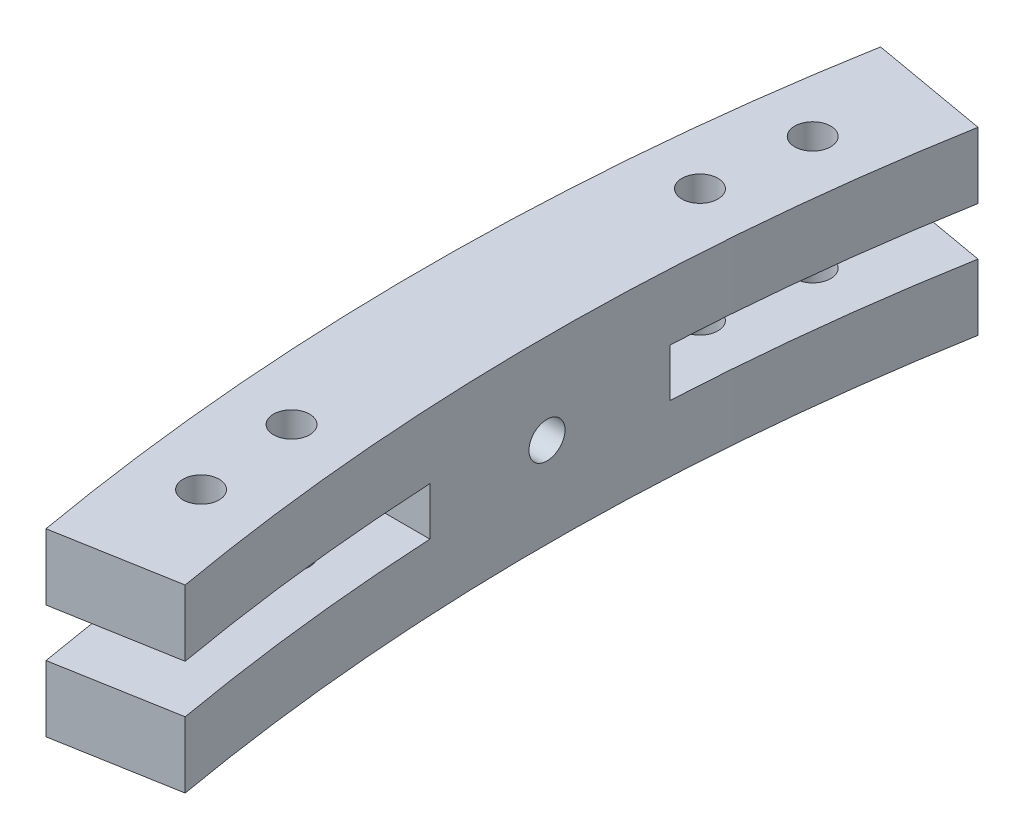
ISO-10303-21;
HEADER;
FILE_DESCRIPTION(('STEP AP214'),'2;1');
FILE_NAME('part.step','',(''),(''),'','','');
FILE_SCHEMA(('AUTOMOTIVE_DESIGN { 1 0 10303 214 1 1 1 1 }'));
ENDSEC;
DATA;
#1=APPLICATION_CONTEXT('core data for automotive mechanical design processes');
#2=APPLICATION_PROTOCOL_DEFINITION('international standard','automotive_design',2000,#1);
#3=PRODUCT_CONTEXT('',#1,'mechanical');
#4=PRODUCT('Part','Part','',(#3));
#5=PRODUCT_RELATED_PRODUCT_CATEGORY('part','',(#4));
#6=PRODUCT_DEFINITION_FORMATION('','',#4);
#7=PRODUCT_DEFINITION_CONTEXT('part definition',#1,'design');
#8=PRODUCT_DEFINITION('design','',#6,#7);
#9=PRODUCT_DEFINITION_SHAPE('','',#8);
#10=(LENGTH_UNIT() NAMED_UNIT(*) SI_UNIT(.MILLI.,.METRE.));
#11=(NAMED_UNIT(*) PLANE_ANGLE_UNIT() SI_UNIT($,.RADIAN.));
#12=(NAMED_UNIT(*) SI_UNIT($,.STERADIAN.) SOLID_ANGLE_UNIT());
#13=UNCERTAINTY_MEASURE_WITH_UNIT(LENGTH_MEASURE(1.E-05),#10,'distance_accuracy_value','');
#14=(GEOMETRIC_REPRESENTATION_CONTEXT(3) GLOBAL_UNCERTAINTY_ASSIGNED_CONTEXT((#13)) GLOBAL_UNIT_ASSIGNED_CONTEXT((#10,
#11,#12)) REPRESENTATION_CONTEXT('',''));
#15=CARTESIAN_POINT('',(0.,0.,0.));
#16=DIRECTION('',(0.,0.,1.));
#17=DIRECTION('',(1.,0.,0.));
#18=AXIS2_PLACEMENT_3D('',#15,#16,#17);
#19=CARTESIAN_POINT('',(0.,7.5,0.));
#20=DIRECTION('',(-0.173648177666931,0.,0.984807753012208));
#21=DIRECTION('',(0.984807753012208,0.,0.173648177666931));
#22=AXIS2_PLACEMENT_3D('',#19,#20,#21);
#23=PLANE('',#22);
#24=DIRECTION('',(0.984807753012207,0.,0.173648177666939));
#25=VECTOR('',#24,1.);
#26=CARTESIAN_POINT('',(-187.11347307232,-2.,-32.9931537567168));
#27=LINE('',#26,#25);
#28=CARTESIAN_POINT('',(-196.961550602442,-2.,-34.7296355333861));
#29=VERTEX_POINT('',#28);
#30=CARTESIAN_POINT('',(-187.11347307232,-2.,-32.9931537567168));
#31=VERTEX_POINT('',#30);
#32=EDGE_CURVE('E51',#29,#31,#27,.T.);
#33=ORIENTED_EDGE('',*,*,#32,.T.);
#34=DIRECTION('',(0.,-1.,0.));
#35=VECTOR('',#34,1.);
#36=CARTESIAN_POINT('',(-187.11347307232,7.5,-32.9931537567168));
#37=LINE('',#36,#35);
#38=CARTESIAN_POINT('',(-187.11347307232,-7.5,-32.9931537567168));
#39=VERTEX_POINT('',#38);
#40=EDGE_CURVE('E43',#31,#39,#37,.T.);
#41=ORIENTED_EDGE('',*,*,#40,.T.);
#42=DIRECTION('',(-0.984807753012208,0.,-0.173648177666931));
#43=VECTOR('',#42,1.);
#44=CARTESIAN_POINT('',(0.,-7.5,0.));
#45=LINE('',#44,#43);
#46=CARTESIAN_POINT('',(-196.961550602442,-7.49999999999999,-34.7296355333861));
#47=VERTEX_POINT('',#46);
#48=EDGE_CURVE('E203',#39,#47,#45,.T.);
#49=ORIENTED_EDGE('',*,*,#48,.T.);
#50=DIRECTION('',(0.,-1.,0.));
#51=VECTOR('',#50,1.);
#52=CARTESIAN_POINT('',(-196.961550602442,7.50000000000001,-34.7296355333861));
#53=LINE('',#52,#51);
#54=EDGE_CURVE('E216',#29,#47,#53,.T.);
#55=ORIENTED_EDGE('',*,*,#54,.F.);
#56=EDGE_LOOP('',(#33,#41,#49,#55));
#57=FACE_BOUND('',#56,.T.);
#58=ADVANCED_FACE('F33',(#57),#23,.F.);
#59=CARTESIAN_POINT('',(0.,7.5,0.));
#60=DIRECTION('',(0.17364817766693,0.,0.984807753012208));
#61=DIRECTION('',(0.984807753012208,0.,-0.17364817766693));
#62=AXIS2_PLACEMENT_3D('',#59,#60,#61);
#63=PLANE('',#62);
#64=DIRECTION('',(0.,-1.,0.));
#65=VECTOR('',#64,1.);
#66=CARTESIAN_POINT('',(-187.11347307232,7.5,32.9931537567168));
#67=LINE('',#66,#65);
#68=CARTESIAN_POINT('',(-187.11347307232,-2.,32.9931537567168));
#69=VERTEX_POINT('',#68);
#70=CARTESIAN_POINT('',(-187.11347307232,-7.5,32.9931537567168));
#71=VERTEX_POINT('',#70);
#72=EDGE_CURVE('E200',#69,#71,#67,.T.);
#73=ORIENTED_EDGE('',*,*,#72,.F.);
#74=DIRECTION('',(-0.984807753012207,0.,0.173648177666939));
#75=VECTOR('',#74,1.);
#76=CARTESIAN_POINT('',(-187.11347307232,-2.,32.9931537567168));
#77=LINE('',#76,#75);
#78=CARTESIAN_POINT('',(-196.961550602442,-2.,34.7296355333861));
#79=VERTEX_POINT('',#78);
#80=EDGE_CURVE('E146',#69,#79,#77,.T.);
#81=ORIENTED_EDGE('',*,*,#80,.T.);
#82=DIRECTION('',(0.,-1.,0.));
#83=VECTOR('',#82,1.);
#84=CARTESIAN_POINT('',(-196.961550602442,7.49999999999999,34.7296355333861));
#85=LINE('',#84,#83);
#86=CARTESIAN_POINT('',(-196.961550602442,-7.50000000000001,34.7296355333861));
#87=VERTEX_POINT('',#86);
#88=EDGE_CURVE('E145',#79,#87,#85,.T.);
#89=ORIENTED_EDGE('',*,*,#88,.T.);
#90=DIRECTION('',(-0.98480775301221,0.,0.173648177666931));
#91=VECTOR('',#90,1.);
#92=CARTESIAN_POINT('',(0.,-7.5,0.));
#93=LINE('',#92,#91);
#94=EDGE_CURVE('E193',#71,#87,#93,.T.);
#95=ORIENTED_EDGE('',*,*,#94,.F.);
#96=EDGE_LOOP('',(#73,#81,#89,#95));
#97=FACE_BOUND('',#96,.T.);
#98=ADVANCED_FACE('F303',(#97),#63,.T.);
#99=CARTESIAN_POINT('',(0.,7.5,0.));
#100=DIRECTION('',(0.,-1.,0.));
#101=DIRECTION('',(0.,0.,-1.));
#102=AXIS2_PLACEMENT_3D('',#99,#100,#101);
#103=CYLINDRICAL_SURFACE('',#102,190.);
#104=CARTESIAN_POINT('',(-189.994078855105,0.,1.5));
#105=CARTESIAN_POINT('',(-189.994078935175,-0.0842542498652497,1.49999626420756));
#106=CARTESIAN_POINT('',(-189.994135501681,-0.168569558574836,1.49287740125156));
#107=CARTESIAN_POINT('',(-189.994355718061,-0.334877991761664,1.464577685945));
#108=CARTESIAN_POINT('',(-189.994519496756,-0.41686819872606,1.44337991673716));
#109=CARTESIAN_POINT('',(-189.994935583111,-0.576092976261965,1.38752596472184));
#110=CARTESIAN_POINT('',(-189.995187848409,-0.653329801684315,1.35287622100358));
#111=CARTESIAN_POINT('',(-189.995752428164,-0.800868351435513,1.27111077045056));
#112=CARTESIAN_POINT('',(-189.996064727703,-0.871171792112026,1.22399815946503));
#113=CARTESIAN_POINT('',(-189.996714250838,-1.0028815252355,1.11863372876489));
#114=CARTESIAN_POINT('',(-189.997051477522,-1.06428671237465,1.06038052728897));
#115=CARTESIAN_POINT('',(-189.997712818179,-1.17644801969412,0.93438959994903));
#116=CARTESIAN_POINT('',(-189.998036931636,-1.22720372126568,0.866651501428184));
#117=CARTESIAN_POINT('',(-189.998635488171,-1.31662216222264,0.723615732245298));
#118=CARTESIAN_POINT('',(-189.998909931527,-1.35528496906106,0.648318103752686));
#119=CARTESIAN_POINT('',(-189.999378208169,-1.41942025816344,0.492300545057282));
#120=CARTESIAN_POINT('',(-189.999572041629,-1.44489276877503,0.411580626508104));
#121=CARTESIAN_POINT('',(-189.99985724286,-1.48192402376422,0.24701140420058));
#122=CARTESIAN_POINT('',(-189.9999486126,-1.49348303569622,0.163162160650631));
#123=CARTESIAN_POINT('',(-190.000018591789,-1.50235997363369,-0.00528669248303473));
#124=CARTESIAN_POINT('',(-189.999997201456,-1.49967792745955,-0.0898863006005673));
#125=CARTESIAN_POINT('',(-189.999844074324,-1.48014918474189,-0.257432546271555));
#126=CARTESIAN_POINT('',(-189.999712339944,-1.46330279884005,-0.340379220035087));
#127=CARTESIAN_POINT('',(-189.999353378988,-1.41592405232442,-0.502267051856959));
#128=CARTESIAN_POINT('',(-189.999126152304,-1.38539167617525,-0.581208205368402));
#129=CARTESIAN_POINT('',(-189.998601820089,-1.31150731724564,-0.732844997240332));
#130=CARTESIAN_POINT('',(-189.998304713789,-1.26815519328015,-0.805540566806263));
#131=CARTESIAN_POINT('',(-189.997674117993,-1.16986209963765,-0.942621805353064));
#132=CARTESIAN_POINT('',(-189.997340628504,-1.11492113249175,-1.00700747614889));
#133=CARTESIAN_POINT('',(-189.996674852802,-0.995008156989786,-1.12564307970718));
#134=CARTESIAN_POINT('',(-189.996342566623,-0.930035873617452,-1.17989273449281));
#135=CARTESIAN_POINT('',(-189.995716669408,-0.791905598254803,-1.27671418714655));
#136=CARTESIAN_POINT('',(-189.995423058377,-0.718747605179786,-1.31928598346721));
#137=CARTESIAN_POINT('',(-189.994907614909,-0.566322506994446,-1.3915431898295));
#138=CARTESIAN_POINT('',(-189.994685782515,-0.487055398227194,-1.42122859215723));
#139=CARTESIAN_POINT('',(-189.994338908491,-0.324662293857678,-1.46687015760124));
#140=CARTESIAN_POINT('',(-189.994213866839,-0.241536299144512,-1.48282632388076));
#141=CARTESIAN_POINT('',(-189.994074675207,-0.0737875239848442,-1.50055613342709));
#142=CARTESIAN_POINT('',(-189.994060522234,0.0108352159824113,-1.5023301596617));
#143=CARTESIAN_POINT('',(-189.994144695782,0.179177410319083,-1.4916463268602));
#144=CARTESIAN_POINT('',(-189.9942430223,0.262896864723019,-1.47918846836798));
#145=CARTESIAN_POINT('',(-189.99454106666,0.427054877523202,-1.44039482268101));
#146=CARTESIAN_POINT('',(-189.994740783239,0.507493476766346,-1.41405920832224));
#147=CARTESIAN_POINT('',(-189.995219090235,0.662807610718776,-1.34825781994065));
#148=CARTESIAN_POINT('',(-189.995497680654,0.737683145327146,-1.30879204567965));
#149=CARTESIAN_POINT('',(-189.996102333936,0.879747424625106,-1.21784966841184));
#150=CARTESIAN_POINT('',(-189.996428397815,0.94693600493424,-1.16637280862741));
#151=CARTESIAN_POINT('',(-189.997091233574,1.07171746829914,-1.05286988990802));
#152=CARTESIAN_POINT('',(-189.99742800546,1.12931034604635,-0.990843825137043));
#153=CARTESIAN_POINT('',(-189.998074297715,1.23326677275511,-0.858001586929432));
#154=CARTESIAN_POINT('',(-189.998383817477,1.27963007162096,-0.787185217775669));
#155=CARTESIAN_POINT('',(-189.998940700903,1.35980947576566,-0.638773714203637));
#156=CARTESIAN_POINT('',(-189.999188064638,1.39362559533438,-0.561178587505761));
#157=CARTESIAN_POINT('',(-189.999592745403,1.44775032449014,-0.401413165130037));
#158=CARTESIAN_POINT('',(-189.999750063537,1.46805909960937,-0.319242925533465));
#159=CARTESIAN_POINT('',(-189.999956921438,1.4945932030958,-0.152658900353831));
#160=CARTESIAN_POINT('',(-190.000006461031,1.50081850869532,-0.0682451111440142));
#161=CARTESIAN_POINT('',(-189.99999217624,1.49900887400175,0.100427000874377));
#162=CARTESIAN_POINT('',(-189.999928355149,1.49097434815825,0.18468532813007));
#163=CARTESIAN_POINT('',(-189.999694550289,1.46087393297556,0.350657295959764));
#164=CARTESIAN_POINT('',(-189.999524566305,1.43880801544424,0.432370931420577));
#165=CARTESIAN_POINT('',(-189.9990975949,1.38127078024911,0.590935272061317));
#166=CARTESIAN_POINT('',(-189.998840605864,1.34579921365864,0.66778588690991));
#167=CARTESIAN_POINT('',(-189.998268609015,1.26245914419382,0.814438232011643));
#168=CARTESIAN_POINT('',(-189.997953603469,1.21459112542168,0.884240237376863));
#169=CARTESIAN_POINT('',(-189.997301102054,1.10782113690975,1.01481249589707));
#170=CARTESIAN_POINT('',(-189.996963607928,1.0489200218718,1.07558344800793));
#171=CARTESIAN_POINT('',(-189.996304066323,0.921734120657375,1.18638963989384));
#172=CARTESIAN_POINT('',(-189.995982022702,0.853447006426181,1.2364222082646));
#173=CARTESIAN_POINT('',(-189.995389637901,0.709414633223466,1.32433227043303));
#174=CARTESIAN_POINT('',(-189.995119322094,0.633665741667304,1.36220380533006));
#175=CARTESIAN_POINT('',(-189.994661401408,0.476944130327464,1.42464849448115));
#176=CARTESIAN_POINT('',(-189.99447369746,0.395977801717122,1.44923758524254));
#177=CARTESIAN_POINT('',(-189.994252589345,0.262079819242925,1.47786842844121));
#178=CARTESIAN_POINT('',(-189.994187719833,0.210018141807059,1.48615740416407));
#179=CARTESIAN_POINT('',(-189.994100827688,0.105312262708029,1.49722435752657));
#180=CARTESIAN_POINT('',(-189.994078805053,0.0526680610564884,1.5000023352762));
#181=CARTESIAN_POINT('',(-189.994078855105,0.,1.5));
#182=B_SPLINE_CURVE_WITH_KNOTS('',3,(#104,#105,#106,#107,#108,#109,#110,#111,#112,#113,#114,
#115,#116,#117,#118,#119,#120,#121,#122,#123,#124,#125,#126,#127,#128,#129,#130,#131,#132,#133,
#134,#135,#136,#137,#138,#139,#140,#141,#142,#143,#144,#145,#146,#147,#148,#149,#150,#151,#152,
#153,#154,#155,#156,#157,#158,#159,#160,#161,#162,#163,#164,#165,#166,#167,#168,#169,#170,#171,
#172,#173,#174,#175,#176,#177,#178,#179,#180,#181),.UNSPECIFIED.,.T.,.F.,(4,2,2,2,2,2,2,2,2,2,2,
2,2,2,2,2,2,2,2,2,2,2,2,2,2,2,2,2,2,2,2,2,2,2,2,2,2,2,4),(0.,0.252570510832021,
0.505445054367304,0.758198702780257,1.01088962456841,1.26361190782247,1.51634412319515,
1.76907492882663,2.02180519130515,2.27453059374281,2.52725550247303,2.77997486877449,
3.03269452194583,3.28541695844508,3.53813933974753,3.79086865085986,4.04359799546178,
4.29632749134921,4.54905692900731,4.80177954205594,5.05450214544662,5.30722160146062,
5.55994106205903,5.81266592588696,6.06539092952766,6.31812156112909,6.57085190489689,
6.82357915140317,7.07630680647429,7.32902711635661,7.58174793401081,7.83447344461478,
8.08718908735243,8.33988516103543,8.59264402563312,8.84552655363075,9.09810499101899,
9.25598900722368,9.41387302027756),.UNSPECIFIED.);
#183=CARTESIAN_POINT('',(-189.994078855105,0.,1.5));
#184=VERTEX_POINT('',#183);
#185=EDGE_CURVE('E235',#184,#184,#182,.T.);
#186=ORIENTED_EDGE('',*,*,#185,.F.);
#187=EDGE_LOOP('',(#186));
#188=FACE_BOUND('',#187,.T.);
#189=CARTESIAN_POINT('',(0.,2.,0.));
#190=DIRECTION('',(0.,1.,0.));
#191=DIRECTION('',(0.,0.,1.));
#192=AXIS2_PLACEMENT_3D('',#189,#190,#191);
#193=CIRCLE('',#192,190.);
#194=CARTESIAN_POINT('',(-187.11347307232,2.,32.9931537567168));
#195=VERTEX_POINT('',#194);
#196=CARTESIAN_POINT('',(-189.736659610103,2.,10.));
#197=VERTEX_POINT('',#196);
#198=EDGE_CURVE('E162',#195,#197,#193,.F.);
#199=ORIENTED_EDGE('',*,*,#198,.T.);
#200=DIRECTION('',(0.,-1.,0.));
#201=VECTOR('',#200,1.);
#202=CARTESIAN_POINT('',(-189.736659610103,29.7710772670783,10.));
#203=LINE('',#202,#201);
#204=CARTESIAN_POINT('',(-189.736659610103,-2.,10.));
#205=VERTEX_POINT('',#204);
#206=EDGE_CURVE('E135',#197,#205,#203,.T.);
#207=ORIENTED_EDGE('',*,*,#206,.T.);
#208=CARTESIAN_POINT('',(0.,-2.,0.));
#209=DIRECTION('',(0.,1.,0.));
#210=DIRECTION('',(0.,0.,1.));
#211=AXIS2_PLACEMENT_3D('',#208,#209,#210);
#212=CIRCLE('',#211,190.);
#213=EDGE_CURVE('E139',#205,#69,#212,.T.);
#214=ORIENTED_EDGE('',*,*,#213,.T.);
#215=ORIENTED_EDGE('',*,*,#72,.T.);
#216=CARTESIAN_POINT('',(0.,-7.5,0.));
#217=DIRECTION('',(0.,1.,0.));
#218=DIRECTION('',(0.,0.,1.));
#219=AXIS2_PLACEMENT_3D('',#216,#217,#218);
#220=CIRCLE('',#219,190.);
#221=EDGE_CURVE('E160',#39,#71,#220,.T.);
#222=ORIENTED_EDGE('',*,*,#221,.F.);
#223=ORIENTED_EDGE('',*,*,#40,.F.);
#224=CARTESIAN_POINT('',(0.,-2.,0.));
#225=DIRECTION('',(0.,1.,0.));
#226=DIRECTION('',(0.,0.,1.));
#227=AXIS2_PLACEMENT_3D('',#224,#225,#226);
#228=CIRCLE('',#227,190.);
#229=CARTESIAN_POINT('',(-189.736659610103,-2.,-10.));
#230=VERTEX_POINT('',#229);
#231=EDGE_CURVE('E174',#31,#230,#228,.T.);
#232=ORIENTED_EDGE('',*,*,#231,.T.);
#233=DIRECTION('',(0.,-1.,0.));
#234=VECTOR('',#233,1.);
#235=CARTESIAN_POINT('',(-189.736659610103,29.7710772670783,-10.));
#236=LINE('',#235,#234);
#237=CARTESIAN_POINT('',(-189.736659610103,2.,-10.));
#238=VERTEX_POINT('',#237);
#239=EDGE_CURVE('E179',#238,#230,#236,.T.);
#240=ORIENTED_EDGE('',*,*,#239,.F.);
#241=CARTESIAN_POINT('',(0.,2.,0.));
#242=DIRECTION('',(0.,1.,0.));
#243=DIRECTION('',(0.,0.,1.));
#244=AXIS2_PLACEMENT_3D('',#241,#242,#243);
#245=CIRCLE('',#244,190.);
#246=CARTESIAN_POINT('',(-187.11347307232,2.,-32.9931537567168));
#247=VERTEX_POINT('',#246);
#248=EDGE_CURVE('E173',#247,#238,#245,.T.);
#249=ORIENTED_EDGE('',*,*,#248,.F.);
#250=CARTESIAN_POINT('',(-187.11347307232,7.5,-32.9931537567168));
#251=VERTEX_POINT('',#250);
#252=EDGE_CURVE('E11',#251,#247,#37,.T.);
#253=ORIENTED_EDGE('',*,*,#252,.F.);
#254=CARTESIAN_POINT('',(0.,7.5,0.));
#255=DIRECTION('',(0.,1.,0.));
#256=DIRECTION('',(0.,0.,1.));
#257=AXIS2_PLACEMENT_3D('',#254,#255,#256);
#258=CIRCLE('',#257,190.);
#259=CARTESIAN_POINT('',(-187.11347307232,7.5,32.9931537567168));
#260=VERTEX_POINT('',#259);
#261=EDGE_CURVE('E189',#251,#260,#258,.T.);
#262=ORIENTED_EDGE('',*,*,#261,.T.);
#263=EDGE_CURVE('E210',#260,#195,#67,.T.);
#264=ORIENTED_EDGE('',*,*,#263,.T.);
#265=EDGE_LOOP('',(#199,#207,#214,#215,#222,#223,#232,#240,#249,#253,#262,#264));
#266=FACE_BOUND('',#265,.T.);
#267=ADVANCED_FACE('F35',(#188,#266),#103,.F.);
#268=ORIENTED_EDGE('',*,*,#252,.T.);
#269=DIRECTION('',(-0.984807753012207,0.,-0.173648177666939));
#270=VECTOR('',#269,1.);
#271=CARTESIAN_POINT('',(-187.11347307232,2.,-32.9931537567168));
#272=LINE('',#271,#270);
#273=CARTESIAN_POINT('',(-196.961550602442,2.,-34.7296355333861));
#274=VERTEX_POINT('',#273);
#275=EDGE_CURVE('E151',#247,#274,#272,.T.);
#276=ORIENTED_EDGE('',*,*,#275,.T.);
#277=CARTESIAN_POINT('',(-196.961550602442,7.50000000000001,-34.7296355333861));
#278=VERTEX_POINT('',#277);
#279=EDGE_CURVE('E217',#278,#274,#53,.T.);
#280=ORIENTED_EDGE('',*,*,#279,.F.);
#281=DIRECTION('',(-0.984807753012208,0.,-0.173648177666931));
#282=VECTOR('',#281,1.);
#283=CARTESIAN_POINT('',(0.,7.5,0.));
#284=LINE('',#283,#282);
#285=EDGE_CURVE('E192',#251,#278,#284,.T.);
#286=ORIENTED_EDGE('',*,*,#285,.F.);
#287=EDGE_LOOP('',(#268,#276,#280,#286));
#288=FACE_BOUND('',#287,.T.);
#289=ADVANCED_FACE('F305',(#288),#23,.F.);
#290=CARTESIAN_POINT('',(0.,7.5,0.));
#291=DIRECTION('',(0.,-1.,0.));
#292=DIRECTION('',(0.,0.,-1.));
#293=AXIS2_PLACEMENT_3D('',#290,#291,#292);
#294=CYLINDRICAL_SURFACE('',#293,200.);
#295=DIRECTION('',(0.,-1.,0.));
#296=VECTOR('',#295,1.);
#297=CARTESIAN_POINT('',(-199.749843554382,29.7710772670783,10.));
#298=LINE('',#297,#296);
#299=CARTESIAN_POINT('',(-199.749843554382,2.,10.));
#300=VERTEX_POINT('',#299);
#301=CARTESIAN_POINT('',(-199.749843554382,-2.,10.));
#302=VERTEX_POINT('',#301);
#303=EDGE_CURVE('E126',#300,#302,#298,.T.);
#304=ORIENTED_EDGE('',*,*,#303,.F.);
#305=CARTESIAN_POINT('',(0.,2.,0.));
#306=DIRECTION('',(0.,1.,0.));
#307=DIRECTION('',(0.,0.,1.));
#308=AXIS2_PLACEMENT_3D('',#305,#306,#307);
#309=CIRCLE('',#308,200.);
#310=CARTESIAN_POINT('',(-196.961550602442,2.,34.729635533386));
#311=VERTEX_POINT('',#310);
#312=EDGE_CURVE('E158',#300,#311,#309,.T.);
#313=ORIENTED_EDGE('',*,*,#312,.T.);
#314=CARTESIAN_POINT('',(-196.961550602442,7.49999999999999,34.7296355333861));
#315=VERTEX_POINT('',#314);
#316=EDGE_CURVE('E213',#315,#311,#85,.T.);
#317=ORIENTED_EDGE('',*,*,#316,.F.);
#318=CARTESIAN_POINT('',(0.,7.5,0.));
#319=DIRECTION('',(0.,1.,0.));
#320=DIRECTION('',(0.,0.,1.));
#321=AXIS2_PLACEMENT_3D('',#318,#319,#320);
#322=CIRCLE('',#321,200.);
#323=EDGE_CURVE('E195',#278,#315,#322,.T.);
#324=ORIENTED_EDGE('',*,*,#323,.F.);
#325=ORIENTED_EDGE('',*,*,#279,.T.);
#326=CARTESIAN_POINT('',(0.,2.,0.));
#327=DIRECTION('',(0.,1.,0.));
#328=DIRECTION('',(0.,0.,1.));
#329=AXIS2_PLACEMENT_3D('',#326,#327,#328);
#330=CIRCLE('',#329,200.);
#331=CARTESIAN_POINT('',(-199.749843554382,2.,-10.));
#332=VERTEX_POINT('',#331);
#333=EDGE_CURVE('E147',#274,#332,#330,.T.);
#334=ORIENTED_EDGE('',*,*,#333,.T.);
#335=DIRECTION('',(0.,-1.,0.));
#336=VECTOR('',#335,1.);
#337=CARTESIAN_POINT('',(-199.749843554382,29.7710772670783,-10.));
#338=LINE('',#337,#336);
#339=CARTESIAN_POINT('',(-199.749843554382,-2.,-10.));
#340=VERTEX_POINT('',#339);
#341=EDGE_CURVE('E183',#332,#340,#338,.T.);
#342=ORIENTED_EDGE('',*,*,#341,.T.);
#343=CARTESIAN_POINT('',(0.,-2.,0.));
#344=DIRECTION('',(0.,1.,0.));
#345=DIRECTION('',(0.,0.,1.));
#346=AXIS2_PLACEMENT_3D('',#343,#344,#345);
#347=CIRCLE('',#346,200.);
#348=EDGE_CURVE('E168',#29,#340,#347,.T.);
#349=ORIENTED_EDGE('',*,*,#348,.F.);
#350=ORIENTED_EDGE('',*,*,#54,.T.);
#351=CARTESIAN_POINT('',(0.,-7.5,0.));
#352=DIRECTION('',(0.,1.,0.));
#353=DIRECTION('',(0.,0.,1.));
#354=AXIS2_PLACEMENT_3D('',#351,#352,#353);
#355=CIRCLE('',#354,200.);
#356=EDGE_CURVE('E206',#47,#87,#355,.T.);
#357=ORIENTED_EDGE('',*,*,#356,.T.);
#358=ORIENTED_EDGE('',*,*,#88,.F.);
#359=CARTESIAN_POINT('',(0.,-2.,0.));
#360=DIRECTION('',(0.,1.,0.));
#361=DIRECTION('',(0.,0.,1.));
#362=AXIS2_PLACEMENT_3D('',#359,#360,#361);
#363=CIRCLE('',#362,200.);
#364=EDGE_CURVE('E59',#79,#302,#363,.F.);
#365=ORIENTED_EDGE('',*,*,#364,.T.);
#366=EDGE_LOOP('',(#304,#313,#317,#324,#325,#334,#342,#349,#350,#357,#358,#365));
#367=FACE_BOUND('',#366,.T.);
#368=ADVANCED_FACE('F143',(#367),#294,.T.);
#369=DIRECTION('',(0.984807753012207,0.,-0.173648177666939));
#370=VECTOR('',#369,1.);
#371=CARTESIAN_POINT('',(-187.11347307232,2.,32.9931537567168));
#372=LINE('',#371,#370);
#373=EDGE_CURVE('E134',#311,#195,#372,.T.);
#374=ORIENTED_EDGE('',*,*,#373,.T.);
#375=ORIENTED_EDGE('',*,*,#263,.F.);
#376=DIRECTION('',(-0.98480775301221,0.,0.173648177666931));
#377=VECTOR('',#376,1.);
#378=CARTESIAN_POINT('',(0.,7.5,0.));
#379=LINE('',#378,#377);
#380=EDGE_CURVE('E197',#260,#315,#379,.T.);
#381=ORIENTED_EDGE('',*,*,#380,.T.);
#382=ORIENTED_EDGE('',*,*,#316,.T.);
#383=EDGE_LOOP('',(#374,#375,#381,#382));
#384=FACE_BOUND('',#383,.T.);
#385=ADVANCED_FACE('F295',(#384),#63,.T.);
#386=CARTESIAN_POINT('',(0.,7.5,0.));
#387=DIRECTION('',(0.,1.,0.));
#388=DIRECTION('',(0.,0.,1.));
#389=AXIS2_PLACEMENT_3D('',#386,#387,#388);
#390=PLANE('',#389);
#391=CARTESIAN_POINT('',(-193.331747967893,7.50000000000001,-25.4526074829102));
#392=DIRECTION('',(0.,1.,0.));
#393=DIRECTION('',(0.,0.,1.));
#394=AXIS2_PLACEMENT_3D('',#391,#392,#393);
#395=CIRCLE('',#394,1.5);
#396=CARTESIAN_POINT('',(-193.331747967893,7.50000000000001,-23.9526074829102));
#397=VERTEX_POINT('',#396);
#398=EDGE_CURVE('E398',#397,#397,#395,.T.);
#399=ORIENTED_EDGE('',*,*,#398,.F.);
#400=EDGE_LOOP('',(#399));
#401=FACE_BOUND('',#400,.T.);
#402=CARTESIAN_POINT('',(-194.25796612789,7.50000000000001,-16.9953698357934));
#403=DIRECTION('',(0.,1.,0.));
#404=DIRECTION('',(0.,0.,1.));
#405=AXIS2_PLACEMENT_3D('',#402,#403,#404);
#406=CIRCLE('',#405,1.5);
#407=CARTESIAN_POINT('',(-194.25796612789,7.50000000000001,-15.4953698357934));
#408=VERTEX_POINT('',#407);
#409=EDGE_CURVE('E404',#408,#408,#406,.T.);
#410=ORIENTED_EDGE('',*,*,#409,.F.);
#411=EDGE_LOOP('',(#410));
#412=FACE_BOUND('',#411,.T.);
#413=CARTESIAN_POINT('',(-194.25796612789,7.50000000000001,16.9953698357934));
#414=DIRECTION('',(0.,1.,0.));
#415=DIRECTION('',(0.,0.,-1.));
#416=AXIS2_PLACEMENT_3D('',#413,#414,#415);
#417=CIRCLE('',#416,1.5);
#418=CARTESIAN_POINT('',(-194.25796612789,7.50000000000001,15.4953698357934));
#419=VERTEX_POINT('',#418);
#420=EDGE_CURVE('E410',#419,#419,#417,.T.);
#421=ORIENTED_EDGE('',*,*,#420,.F.);
#422=EDGE_LOOP('',(#421));
#423=FACE_BOUND('',#422,.T.);
#424=CARTESIAN_POINT('',(-193.331747967893,7.50000000000001,25.4526074829102));
#425=DIRECTION('',(0.,1.,0.));
#426=DIRECTION('',(0.,0.,-1.));
#427=AXIS2_PLACEMENT_3D('',#424,#425,#426);
#428=CIRCLE('',#427,1.5);
#429=CARTESIAN_POINT('',(-193.331747967893,7.50000000000001,23.9526074829102));
#430=VERTEX_POINT('',#429);
#431=EDGE_CURVE('E241',#430,#430,#428,.T.);
#432=ORIENTED_EDGE('',*,*,#431,.F.);
#433=EDGE_LOOP('',(#432));
#434=FACE_BOUND('',#433,.T.);
#435=ORIENTED_EDGE('',*,*,#261,.F.);
#436=ORIENTED_EDGE('',*,*,#285,.T.);
#437=ORIENTED_EDGE('',*,*,#323,.T.);
#438=ORIENTED_EDGE('',*,*,#380,.F.);
#439=EDGE_LOOP('',(#435,#436,#437,#438));
#440=FACE_BOUND('',#439,.T.);
#441=ADVANCED_FACE('F292',(#401,#412,#423,#434,#440),#390,.T.);
#442=CARTESIAN_POINT('',(0.,-7.5,0.));
#443=DIRECTION('',(0.,1.,0.));
#444=DIRECTION('',(0.,0.,1.));
#445=AXIS2_PLACEMENT_3D('',#442,#443,#444);
#446=PLANE('',#445);
#447=CARTESIAN_POINT('',(-193.331747967893,-7.50000000000001,-25.4526074829102));
#448=DIRECTION('',(0.,1.,0.));
#449=DIRECTION('',(0.,0.,1.));
#450=AXIS2_PLACEMENT_3D('',#447,#448,#449);
#451=CIRCLE('',#450,1.5);
#452=CARTESIAN_POINT('',(-193.331747967893,-7.50000000000001,-23.9526074829102));
#453=VERTEX_POINT('',#452);
#454=EDGE_CURVE('E224',#453,#453,#451,.T.);
#455=ORIENTED_EDGE('',*,*,#454,.T.);
#456=EDGE_LOOP('',(#455));
#457=FACE_BOUND('',#456,.T.);
#458=CARTESIAN_POINT('',(-194.25796612789,-7.50000000000001,-16.9953698357934));
#459=DIRECTION('',(0.,1.,0.));
#460=DIRECTION('',(0.,0.,1.));
#461=AXIS2_PLACEMENT_3D('',#458,#459,#460);
#462=CIRCLE('',#461,1.5);
#463=CARTESIAN_POINT('',(-194.25796612789,-7.50000000000001,-15.4953698357934));
#464=VERTEX_POINT('',#463);
#465=EDGE_CURVE('E401',#464,#464,#462,.T.);
#466=ORIENTED_EDGE('',*,*,#465,.T.);
#467=EDGE_LOOP('',(#466));
#468=FACE_BOUND('',#467,.T.);
#469=CARTESIAN_POINT('',(-194.25796612789,-7.50000000000001,16.9953698357934));
#470=DIRECTION('',(0.,1.,0.));
#471=DIRECTION('',(0.,0.,-1.));
#472=AXIS2_PLACEMENT_3D('',#469,#470,#471);
#473=CIRCLE('',#472,1.5);
#474=CARTESIAN_POINT('',(-194.25796612789,-7.50000000000001,15.4953698357934));
#475=VERTEX_POINT('',#474);
#476=EDGE_CURVE('E407',#475,#475,#473,.T.);
#477=ORIENTED_EDGE('',*,*,#476,.T.);
#478=EDGE_LOOP('',(#477));
#479=FACE_BOUND('',#478,.T.);
#480=CARTESIAN_POINT('',(-193.331747967893,-7.50000000000001,25.4526074829102));
#481=DIRECTION('',(0.,1.,0.));
#482=DIRECTION('',(0.,0.,-1.));
#483=AXIS2_PLACEMENT_3D('',#480,#481,#482);
#484=CIRCLE('',#483,1.5);
#485=CARTESIAN_POINT('',(-193.331747967893,-7.50000000000001,23.9526074829102));
#486=VERTEX_POINT('',#485);
#487=EDGE_CURVE('E413',#486,#486,#484,.T.);
#488=ORIENTED_EDGE('',*,*,#487,.T.);
#489=EDGE_LOOP('',(#488));
#490=FACE_BOUND('',#489,.T.);
#491=ORIENTED_EDGE('',*,*,#221,.T.);
#492=ORIENTED_EDGE('',*,*,#94,.T.);
#493=ORIENTED_EDGE('',*,*,#356,.F.);
#494=ORIENTED_EDGE('',*,*,#48,.F.);
#495=EDGE_LOOP('',(#491,#492,#493,#494));
#496=FACE_BOUND('',#495,.T.);
#497=ADVANCED_FACE('F278',(#457,#468,#479,#490,#496),#446,.F.);
#498=CARTESIAN_POINT('',(-189.736659610103,29.7710772670783,10.));
#499=DIRECTION('',(0.,0.,1.));
#500=DIRECTION('',(1.,0.,0.));
#501=AXIS2_PLACEMENT_3D('',#498,#499,#500);
#502=PLANE('',#501);
#503=DIRECTION('',(-1.,0.,0.));
#504=VECTOR('',#503,1.);
#505=CARTESIAN_POINT('',(-189.736659610103,2.,10.));
#506=LINE('',#505,#504);
#507=EDGE_CURVE('E131',#197,#300,#506,.T.);
#508=ORIENTED_EDGE('',*,*,#507,.T.);
#509=ORIENTED_EDGE('',*,*,#303,.T.);
#510=DIRECTION('',(1.,0.,0.));
#511=VECTOR('',#510,1.);
#512=CARTESIAN_POINT('',(-189.736659610103,-2.,10.));
#513=LINE('',#512,#511);
#514=EDGE_CURVE('E129',#302,#205,#513,.T.);
#515=ORIENTED_EDGE('',*,*,#514,.T.);
#516=ORIENTED_EDGE('',*,*,#206,.F.);
#517=EDGE_LOOP('',(#508,#509,#515,#516));
#518=FACE_BOUND('',#517,.T.);
#519=ADVANCED_FACE('F127',(#518),#502,.T.);
#520=CARTESIAN_POINT('',(0.,2.,0.));
#521=DIRECTION('',(0.,1.,0.));
#522=DIRECTION('',(0.,0.,1.));
#523=AXIS2_PLACEMENT_3D('',#520,#521,#522);
#524=PLANE('',#523);
#525=CARTESIAN_POINT('',(-194.25796612789,2.,16.9953698357934));
#526=DIRECTION('',(0.,1.,0.));
#527=DIRECTION('',(0.,0.,1.));
#528=AXIS2_PLACEMENT_3D('',#525,#526,#527);
#529=CIRCLE('',#528,1.5);
#530=CARTESIAN_POINT('',(-194.25796612789,2.,18.4953698357934));
#531=VERTEX_POINT('',#530);
#532=EDGE_CURVE('E154',#531,#531,#529,.T.);
#533=ORIENTED_EDGE('',*,*,#532,.T.);
#534=EDGE_LOOP('',(#533));
#535=FACE_BOUND('',#534,.T.);
#536=CARTESIAN_POINT('',(-193.331747967893,2.,25.4526074829102));
#537=DIRECTION('',(0.,1.,0.));
#538=DIRECTION('',(0.,0.,1.));
#539=AXIS2_PLACEMENT_3D('',#536,#537,#538);
#540=CIRCLE('',#539,1.5);
#541=CARTESIAN_POINT('',(-193.331747967893,2.,26.9526074829102));
#542=VERTEX_POINT('',#541);
#543=EDGE_CURVE('E232',#542,#542,#540,.T.);
#544=ORIENTED_EDGE('',*,*,#543,.T.);
#545=EDGE_LOOP('',(#544));
#546=FACE_BOUND('',#545,.T.);
#547=ORIENTED_EDGE('',*,*,#373,.F.);
#548=ORIENTED_EDGE('',*,*,#312,.F.);
#549=ORIENTED_EDGE('',*,*,#507,.F.);
#550=ORIENTED_EDGE('',*,*,#198,.F.);
#551=EDGE_LOOP('',(#547,#548,#549,#550));
#552=FACE_BOUND('',#551,.T.);
#553=ADVANCED_FACE('F274',(#535,#546,#552),#524,.F.);
#554=CARTESIAN_POINT('',(0.,-2.,0.));
#555=DIRECTION('',(0.,1.,0.));
#556=DIRECTION('',(0.,0.,1.));
#557=AXIS2_PLACEMENT_3D('',#554,#555,#556);
#558=PLANE('',#557);
#559=CARTESIAN_POINT('',(-194.25796612789,-2.,16.9953698357934));
#560=DIRECTION('',(0.,1.,0.));
#561=DIRECTION('',(0.,0.,1.));
#562=AXIS2_PLACEMENT_3D('',#559,#560,#561);
#563=CIRCLE('',#562,1.5);
#564=CARTESIAN_POINT('',(-194.25796612789,-2.,18.4953698357934));
#565=VERTEX_POINT('',#564);
#566=EDGE_CURVE('E233',#565,#565,#563,.T.);
#567=ORIENTED_EDGE('',*,*,#566,.F.);
#568=EDGE_LOOP('',(#567));
#569=FACE_BOUND('',#568,.T.);
#570=CARTESIAN_POINT('',(-193.331747967893,-2.,25.4526074829102));
#571=DIRECTION('',(0.,1.,0.));
#572=DIRECTION('',(0.,0.,1.));
#573=AXIS2_PLACEMENT_3D('',#570,#571,#572);
#574=CIRCLE('',#573,1.5);
#575=CARTESIAN_POINT('',(-193.331747967893,-2.,26.9526074829102));
#576=VERTEX_POINT('',#575);
#577=EDGE_CURVE('E229',#576,#576,#574,.T.);
#578=ORIENTED_EDGE('',*,*,#577,.F.);
#579=EDGE_LOOP('',(#578));
#580=FACE_BOUND('',#579,.T.);
#581=ORIENTED_EDGE('',*,*,#213,.F.);
#582=ORIENTED_EDGE('',*,*,#514,.F.);
#583=ORIENTED_EDGE('',*,*,#364,.F.);
#584=ORIENTED_EDGE('',*,*,#80,.F.);
#585=EDGE_LOOP('',(#581,#582,#583,#584));
#586=FACE_BOUND('',#585,.T.);
#587=ADVANCED_FACE('F137',(#569,#580,#586),#558,.T.);
#588=CARTESIAN_POINT('',(-189.736659610103,29.7710772670783,-10.));
#589=DIRECTION('',(0.,0.,-1.));
#590=DIRECTION('',(-1.,0.,0.));
#591=AXIS2_PLACEMENT_3D('',#588,#589,#590);
#592=PLANE('',#591);
#593=DIRECTION('',(-1.,0.,0.));
#594=VECTOR('',#593,1.);
#595=CARTESIAN_POINT('',(200.,2.,-10.));
#596=LINE('',#595,#594);
#597=EDGE_CURVE('E180',#238,#332,#596,.T.);
#598=ORIENTED_EDGE('',*,*,#597,.F.);
#599=ORIENTED_EDGE('',*,*,#239,.T.);
#600=DIRECTION('',(-1.,0.,0.));
#601=VECTOR('',#600,1.);
#602=CARTESIAN_POINT('',(200.,-2.,-10.));
#603=LINE('',#602,#601);
#604=EDGE_CURVE('E170',#230,#340,#603,.T.);
#605=ORIENTED_EDGE('',*,*,#604,.T.);
#606=ORIENTED_EDGE('',*,*,#341,.F.);
#607=EDGE_LOOP('',(#598,#599,#605,#606));
#608=FACE_BOUND('',#607,.T.);
#609=ADVANCED_FACE('F273',(#608),#592,.T.);
#610=CARTESIAN_POINT('',(0.,2.,0.));
#611=DIRECTION('',(0.,1.,0.));
#612=DIRECTION('',(0.,0.,1.));
#613=AXIS2_PLACEMENT_3D('',#610,#611,#612);
#614=PLANE('',#613);
#615=CARTESIAN_POINT('',(-193.331747967893,2.,-25.4526074829102));
#616=DIRECTION('',(0.,1.,0.));
#617=DIRECTION('',(0.,0.,1.));
#618=AXIS2_PLACEMENT_3D('',#615,#616,#617);
#619=CIRCLE('',#618,1.5);
#620=CARTESIAN_POINT('',(-193.331747967893,2.,-23.9526074829102));
#621=VERTEX_POINT('',#620);
#622=EDGE_CURVE('E228',#621,#621,#619,.T.);
#623=ORIENTED_EDGE('',*,*,#622,.T.);
#624=EDGE_LOOP('',(#623));
#625=FACE_BOUND('',#624,.T.);
#626=CARTESIAN_POINT('',(-194.25796612789,2.,-16.9953698357934));
#627=DIRECTION('',(0.,1.,0.));
#628=DIRECTION('',(0.,0.,1.));
#629=AXIS2_PLACEMENT_3D('',#626,#627,#628);
#630=CIRCLE('',#629,1.5);
#631=CARTESIAN_POINT('',(-194.25796612789,2.,-15.4953698357934));
#632=VERTEX_POINT('',#631);
#633=EDGE_CURVE('E223',#632,#632,#630,.T.);
#634=ORIENTED_EDGE('',*,*,#633,.T.);
#635=EDGE_LOOP('',(#634));
#636=FACE_BOUND('',#635,.T.);
#637=ORIENTED_EDGE('',*,*,#248,.T.);
#638=ORIENTED_EDGE('',*,*,#597,.T.);
#639=ORIENTED_EDGE('',*,*,#333,.F.);
#640=ORIENTED_EDGE('',*,*,#275,.F.);
#641=EDGE_LOOP('',(#637,#638,#639,#640));
#642=FACE_BOUND('',#641,.T.);
#643=ADVANCED_FACE('F284',(#625,#636,#642),#614,.F.);
#644=CARTESIAN_POINT('',(0.,-2.,0.));
#645=DIRECTION('',(0.,1.,0.));
#646=DIRECTION('',(0.,0.,1.));
#647=AXIS2_PLACEMENT_3D('',#644,#645,#646);
#648=PLANE('',#647);
#649=CARTESIAN_POINT('',(-193.331747967893,-2.,-25.4526074829102));
#650=DIRECTION('',(0.,1.,0.));
#651=DIRECTION('',(0.,0.,1.));
#652=AXIS2_PLACEMENT_3D('',#649,#650,#651);
#653=CIRCLE('',#652,1.5);
#654=CARTESIAN_POINT('',(-193.331747967893,-2.,-23.9526074829102));
#655=VERTEX_POINT('',#654);
#656=EDGE_CURVE('E225',#655,#655,#653,.T.);
#657=ORIENTED_EDGE('',*,*,#656,.F.);
#658=EDGE_LOOP('',(#657));
#659=FACE_BOUND('',#658,.T.);
#660=CARTESIAN_POINT('',(-194.25796612789,-2.,-16.9953698357934));
#661=DIRECTION('',(0.,1.,0.));
#662=DIRECTION('',(0.,0.,1.));
#663=AXIS2_PLACEMENT_3D('',#660,#661,#662);
#664=CIRCLE('',#663,1.5);
#665=CARTESIAN_POINT('',(-194.25796612789,-2.,-15.4953698357934));
#666=VERTEX_POINT('',#665);
#667=EDGE_CURVE('E220',#666,#666,#664,.T.);
#668=ORIENTED_EDGE('',*,*,#667,.F.);
#669=EDGE_LOOP('',(#668));
#670=FACE_BOUND('',#669,.T.);
#671=ORIENTED_EDGE('',*,*,#348,.T.);
#672=ORIENTED_EDGE('',*,*,#604,.F.);
#673=ORIENTED_EDGE('',*,*,#231,.F.);
#674=ORIENTED_EDGE('',*,*,#32,.F.);
#675=EDGE_LOOP('',(#671,#672,#673,#674));
#676=FACE_BOUND('',#675,.T.);
#677=ADVANCED_FACE('F260',(#659,#670,#676),#648,.T.);
#678=CARTESIAN_POINT('',(-194.25796612789,-7.50000000000001,-16.9953698357934));
#679=DIRECTION('',(0.,1.,0.));
#680=DIRECTION('',(0.,0.,1.));
#681=AXIS2_PLACEMENT_3D('',#678,#679,#680);
#682=CYLINDRICAL_SURFACE('',#681,1.5);
#683=ORIENTED_EDGE('',*,*,#667,.T.);
#684=EDGE_LOOP('',(#683));
#685=FACE_BOUND('',#684,.T.);
#686=ORIENTED_EDGE('',*,*,#465,.F.);
#687=EDGE_LOOP('',(#686));
#688=FACE_BOUND('',#687,.T.);
#689=ADVANCED_FACE('F255',(#685,#688),#682,.F.);
#690=CARTESIAN_POINT('',(-193.331747967893,-7.50000000000001,-25.4526074829102));
#691=DIRECTION('',(0.,1.,0.));
#692=DIRECTION('',(0.,0.,1.));
#693=AXIS2_PLACEMENT_3D('',#690,#691,#692);
#694=CYLINDRICAL_SURFACE('',#693,1.5);
#695=ORIENTED_EDGE('',*,*,#656,.T.);
#696=EDGE_LOOP('',(#695));
#697=FACE_BOUND('',#696,.T.);
#698=ORIENTED_EDGE('',*,*,#454,.F.);
#699=EDGE_LOOP('',(#698));
#700=FACE_BOUND('',#699,.T.);
#701=ADVANCED_FACE('F251',(#697,#700),#694,.F.);
#702=ORIENTED_EDGE('',*,*,#409,.T.);
#703=EDGE_LOOP('',(#702));
#704=FACE_BOUND('',#703,.T.);
#705=ORIENTED_EDGE('',*,*,#633,.F.);
#706=EDGE_LOOP('',(#705));
#707=FACE_BOUND('',#706,.T.);
#708=ADVANCED_FACE('F254',(#704,#707),#682,.F.);
#709=ORIENTED_EDGE('',*,*,#398,.T.);
#710=EDGE_LOOP('',(#709));
#711=FACE_BOUND('',#710,.T.);
#712=ORIENTED_EDGE('',*,*,#622,.F.);
#713=EDGE_LOOP('',(#712));
#714=FACE_BOUND('',#713,.T.);
#715=ADVANCED_FACE('F257',(#711,#714),#694,.F.);
#716=CARTESIAN_POINT('',(-193.331747967893,-7.50000000000001,25.4526074829102));
#717=DIRECTION('',(0.,1.,0.));
#718=DIRECTION('',(0.,0.,1.));
#719=AXIS2_PLACEMENT_3D('',#716,#717,#718);
#720=CYLINDRICAL_SURFACE('',#719,1.5);
#721=ORIENTED_EDGE('',*,*,#577,.T.);
#722=EDGE_LOOP('',(#721));
#723=FACE_BOUND('',#722,.T.);
#724=ORIENTED_EDGE('',*,*,#487,.F.);
#725=EDGE_LOOP('',(#724));
#726=FACE_BOUND('',#725,.T.);
#727=ADVANCED_FACE('F266',(#723,#726),#720,.F.);
#728=CARTESIAN_POINT('',(-194.25796612789,-7.50000000000001,16.9953698357934));
#729=DIRECTION('',(0.,1.,0.));
#730=DIRECTION('',(0.,0.,1.));
#731=AXIS2_PLACEMENT_3D('',#728,#729,#730);
#732=CYLINDRICAL_SURFACE('',#731,1.5);
#733=ORIENTED_EDGE('',*,*,#566,.T.);
#734=EDGE_LOOP('',(#733));
#735=FACE_BOUND('',#734,.T.);
#736=ORIENTED_EDGE('',*,*,#476,.F.);
#737=EDGE_LOOP('',(#736));
#738=FACE_BOUND('',#737,.T.);
#739=ADVANCED_FACE('F262',(#735,#738),#732,.F.);
#740=ORIENTED_EDGE('',*,*,#431,.T.);
#741=EDGE_LOOP('',(#740));
#742=FACE_BOUND('',#741,.T.);
#743=ORIENTED_EDGE('',*,*,#543,.F.);
#744=EDGE_LOOP('',(#743));
#745=FACE_BOUND('',#744,.T.);
#746=ADVANCED_FACE('F265',(#742,#745),#720,.F.);
#747=ORIENTED_EDGE('',*,*,#420,.T.);
#748=EDGE_LOOP('',(#747));
#749=FACE_BOUND('',#748,.T.);
#750=ORIENTED_EDGE('',*,*,#532,.F.);
#751=EDGE_LOOP('',(#750));
#752=FACE_BOUND('',#751,.T.);
#753=ADVANCED_FACE('F248',(#749,#752),#732,.F.);
#754=CARTESIAN_POINT('',(-187.11347307232,0.,0.));
#755=DIRECTION('',(-1.,0.,0.));
#756=DIRECTION('',(0.,0.,1.));
#757=AXIS2_PLACEMENT_3D('',#754,#755,#756);
#758=CYLINDRICAL_SURFACE('',#757,1.5);
#759=CARTESIAN_POINT('',(-193.75,0.,0.));
#760=DIRECTION('',(1.,0.,0.));
#761=DIRECTION('',(0.,0.,-1.));
#762=AXIS2_PLACEMENT_3D('',#759,#760,#761);
#763=CIRCLE('',#762,1.5);
#764=CARTESIAN_POINT('',(-193.75,0.,-1.5));
#765=VERTEX_POINT('',#764);
#766=EDGE_CURVE('E38',#765,#765,#763,.F.);
#767=ORIENTED_EDGE('',*,*,#766,.T.);
#768=EDGE_LOOP('',(#767));
#769=FACE_BOUND('',#768,.T.);
#770=ORIENTED_EDGE('',*,*,#185,.T.);
#771=EDGE_LOOP('',(#770));
#772=FACE_BOUND('',#771,.T.);
#773=ADVANCED_FACE('F242',(#769,#772),#758,.F.);
#774=CARTESIAN_POINT('',(-193.75,0.,-2.99999999999996));
#775=DIRECTION('',(1.,0.,0.));
#776=DIRECTION('',(0.,0.,-1.));
#777=AXIS2_PLACEMENT_3D('',#774,#775,#776);
#778=PLANE('',#777);
#779=CARTESIAN_POINT('',(-193.75,0.,0.));
#780=DIRECTION('',(1.,0.,0.));
#781=DIRECTION('',(0.,0.,-1.));
#782=AXIS2_PLACEMENT_3D('',#779,#780,#781);
#783=CIRCLE('',#782,2.99999999999996);
#784=CARTESIAN_POINT('',(-193.75,0.,-2.99999999999996));
#785=VERTEX_POINT('',#784);
#786=EDGE_CURVE('E393',#785,#785,#783,.T.);
#787=ORIENTED_EDGE('',*,*,#786,.F.);
#788=EDGE_LOOP('',(#787));
#789=FACE_BOUND('',#788,.T.);
#790=ORIENTED_EDGE('',*,*,#766,.F.);
#791=EDGE_LOOP('',(#790));
#792=FACE_BOUND('',#791,.T.);
#793=ADVANCED_FACE('F247',(#789,#792),#778,.F.);
#794=CARTESIAN_POINT('',(0.,0.,0.));
#795=DIRECTION('',(1.,0.,0.));
#796=DIRECTION('',(0.,0.,-1.));
#797=AXIS2_PLACEMENT_3D('',#794,#795,#796);
#798=CYLINDRICAL_SURFACE('',#797,2.99999999999996);
#799=CARTESIAN_POINT('',(-196.25,0.,0.));
#800=DIRECTION('',(1.,0.,0.));
#801=DIRECTION('',(0.,0.,-1.));
#802=AXIS2_PLACEMENT_3D('',#799,#800,#801);
#803=CIRCLE('',#802,2.99999999999996);
#804=CARTESIAN_POINT('',(-196.25,0.,-2.99999999999996));
#805=VERTEX_POINT('',#804);
#806=EDGE_CURVE('E392',#805,#805,#803,.T.);
#807=ORIENTED_EDGE('',*,*,#806,.F.);
#808=EDGE_LOOP('',(#807));
#809=FACE_BOUND('',#808,.T.);
#810=ORIENTED_EDGE('',*,*,#786,.T.);
#811=EDGE_LOOP('',(#810));
#812=FACE_BOUND('',#811,.T.);
#813=ADVANCED_FACE('F368',(#809,#812),#798,.F.);
#814=CARTESIAN_POINT('',(-196.25,0.,-2.99999999999996));
#815=DIRECTION('',(-1.,0.,0.));
#816=DIRECTION('',(0.,0.,1.));
#817=AXIS2_PLACEMENT_3D('',#814,#815,#816);
#818=PLANE('',#817);
#819=ORIENTED_EDGE('',*,*,#806,.T.);
#820=EDGE_LOOP('',(#819));
#821=FACE_BOUND('',#820,.T.);
#822=ADVANCED_FACE('F377',(#821),#818,.F.);
#823=CLOSED_SHELL('',(#58,#98,#267,#289,#368,#385,#441,#497,#519,#553,#587,#609,#643,#677,#689,
#701,#708,#715,#727,#739,#746,#753,#773,#793,#813,#822));
#824=MANIFOLD_SOLID_BREP('B2',#823);
#825=ADVANCED_BREP_SHAPE_REPRESENTATION('',(#18,#824),#14);
#826=SHAPE_DEFINITION_REPRESENTATION(#9,#825);
ENDSEC;
END-ISO-10303-21;
